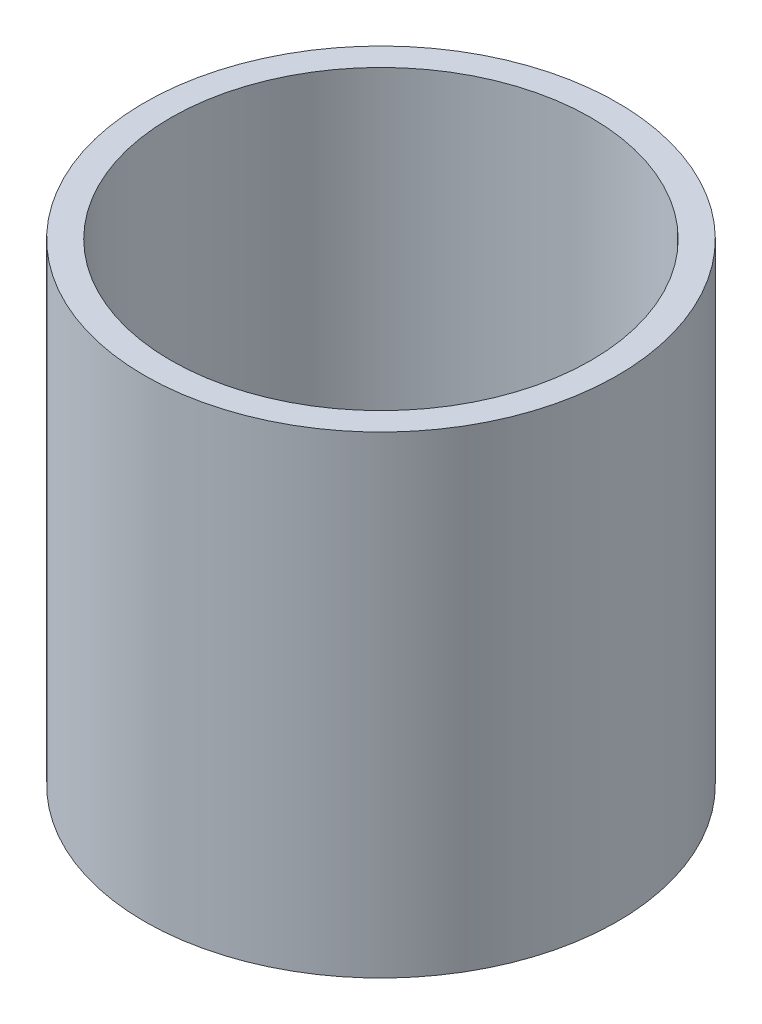
ISO-10303-21;
HEADER;
FILE_DESCRIPTION(('STEP AP214'),'2;1');
FILE_NAME('part.step','',(''),(''),'','','');
FILE_SCHEMA(('AUTOMOTIVE_DESIGN { 1 0 10303 214 1 1 1 1 }'));
ENDSEC;
DATA;
#1=APPLICATION_CONTEXT('core data for automotive mechanical design processes');
#2=APPLICATION_PROTOCOL_DEFINITION('international standard','automotive_design',2000,#1);
#3=PRODUCT_CONTEXT('',#1,'mechanical');
#4=PRODUCT('Part','Part','',(#3));
#5=PRODUCT_RELATED_PRODUCT_CATEGORY('part','',(#4));
#6=PRODUCT_DEFINITION_FORMATION('','',#4);
#7=PRODUCT_DEFINITION_CONTEXT('part definition',#1,'design');
#8=PRODUCT_DEFINITION('design','',#6,#7);
#9=PRODUCT_DEFINITION_SHAPE('','',#8);
#10=(LENGTH_UNIT() NAMED_UNIT(*) SI_UNIT(.MILLI.,.METRE.));
#11=(NAMED_UNIT(*) PLANE_ANGLE_UNIT() SI_UNIT($,.RADIAN.));
#12=(NAMED_UNIT(*) SI_UNIT($,.STERADIAN.) SOLID_ANGLE_UNIT());
#13=UNCERTAINTY_MEASURE_WITH_UNIT(LENGTH_MEASURE(1.E-05),#10,'distance_accuracy_value','');
#14=(GEOMETRIC_REPRESENTATION_CONTEXT(3) GLOBAL_UNCERTAINTY_ASSIGNED_CONTEXT((#13)) GLOBAL_UNIT_ASSIGNED_CONTEXT((#10,
#11,#12)) REPRESENTATION_CONTEXT('',''));
#15=CARTESIAN_POINT('',(0.,0.,0.));
#16=DIRECTION('',(0.,0.,1.));
#17=DIRECTION('',(1.,0.,0.));
#18=AXIS2_PLACEMENT_3D('',#15,#16,#17);
#19=CARTESIAN_POINT('',(0.,2.,0.));
#20=DIRECTION('',(0.,1.,0.));
#21=DIRECTION('',(0.,0.,1.));
#22=AXIS2_PLACEMENT_3D('',#19,#20,#21);
#23=PLANE('',#22);
#24=CARTESIAN_POINT('',(0.,2.,0.));
#25=DIRECTION('',(0.,1.,0.));
#26=DIRECTION('',(0.,0.,1.));
#27=AXIS2_PLACEMENT_3D('',#24,#25,#26);
#28=CIRCLE('',#27,1.);
#29=CARTESIAN_POINT('',(0.,2.,1.));
#30=VERTEX_POINT('',#29);
#31=EDGE_CURVE('E10',#30,#30,#28,.T.);
#32=ORIENTED_EDGE('',*,*,#31,.T.);
#33=EDGE_LOOP('',(#32));
#34=FACE_BOUND('',#33,.T.);
#35=CARTESIAN_POINT('',(0.,2.,0.));
#36=DIRECTION('',(0.,1.,0.));
#37=DIRECTION('',(0.,0.,1.));
#38=AXIS2_PLACEMENT_3D('',#35,#36,#37);
#39=CIRCLE('',#38,0.889);
#40=CARTESIAN_POINT('',(0.,2.,0.889));
#41=VERTEX_POINT('',#40);
#42=EDGE_CURVE('E42',#41,#41,#39,.T.);
#43=ORIENTED_EDGE('',*,*,#42,.F.);
#44=EDGE_LOOP('',(#43));
#45=FACE_BOUND('',#44,.T.);
#46=ADVANCED_FACE('F31',(#34,#45),#23,.T.);
#47=CARTESIAN_POINT('',(0.,0.,0.));
#48=DIRECTION('',(0.,1.,0.));
#49=DIRECTION('',(0.,0.,1.));
#50=AXIS2_PLACEMENT_3D('',#47,#48,#49);
#51=PLANE('',#50);
#52=CARTESIAN_POINT('',(0.,0.,0.));
#53=DIRECTION('',(0.,1.,0.));
#54=DIRECTION('',(0.,0.,1.));
#55=AXIS2_PLACEMENT_3D('',#52,#53,#54);
#56=CIRCLE('',#55,1.);
#57=CARTESIAN_POINT('',(0.,0.,1.));
#58=VERTEX_POINT('',#57);
#59=EDGE_CURVE('E35',#58,#58,#56,.T.);
#60=ORIENTED_EDGE('',*,*,#59,.F.);
#61=EDGE_LOOP('',(#60));
#62=FACE_BOUND('',#61,.T.);
#63=CARTESIAN_POINT('',(0.,0.,0.));
#64=DIRECTION('',(0.,1.,0.));
#65=DIRECTION('',(0.,0.,1.));
#66=AXIS2_PLACEMENT_3D('',#63,#64,#65);
#67=CIRCLE('',#66,0.889);
#68=CARTESIAN_POINT('',(0.,0.,0.889));
#69=VERTEX_POINT('',#68);
#70=EDGE_CURVE('E44',#69,#69,#67,.T.);
#71=ORIENTED_EDGE('',*,*,#70,.T.);
#72=EDGE_LOOP('',(#71));
#73=FACE_BOUND('',#72,.T.);
#74=ADVANCED_FACE('F54',(#62,#73),#51,.F.);
#75=CARTESIAN_POINT('',(0.,2.,0.));
#76=DIRECTION('',(0.,-1.,0.));
#77=DIRECTION('',(0.,0.,-1.));
#78=AXIS2_PLACEMENT_3D('',#75,#76,#77);
#79=CYLINDRICAL_SURFACE('',#78,1.);
#80=ORIENTED_EDGE('',*,*,#31,.F.);
#81=EDGE_LOOP('',(#80));
#82=FACE_BOUND('',#81,.T.);
#83=ORIENTED_EDGE('',*,*,#59,.T.);
#84=EDGE_LOOP('',(#83));
#85=FACE_BOUND('',#84,.T.);
#86=ADVANCED_FACE('F33',(#82,#85),#79,.T.);
#87=CARTESIAN_POINT('',(0.,2.,0.));
#88=DIRECTION('',(0.,-1.,0.));
#89=DIRECTION('',(0.,0.,-1.));
#90=AXIS2_PLACEMENT_3D('',#87,#88,#89);
#91=CYLINDRICAL_SURFACE('',#90,0.889);
#92=ORIENTED_EDGE('',*,*,#42,.T.);
#93=EDGE_LOOP('',(#92));
#94=FACE_BOUND('',#93,.T.);
#95=ORIENTED_EDGE('',*,*,#70,.F.);
#96=EDGE_LOOP('',(#95));
#97=FACE_BOUND('',#96,.T.);
#98=ADVANCED_FACE('F50',(#94,#97),#91,.F.);
#99=CLOSED_SHELL('',(#46,#74,#86,#98));
#100=MANIFOLD_SOLID_BREP('B2',#99);
#101=ADVANCED_BREP_SHAPE_REPRESENTATION('',(#18,#100),#14);
#102=SHAPE_DEFINITION_REPRESENTATION(#9,#101);
ENDSEC;
END-ISO-10303-21;
